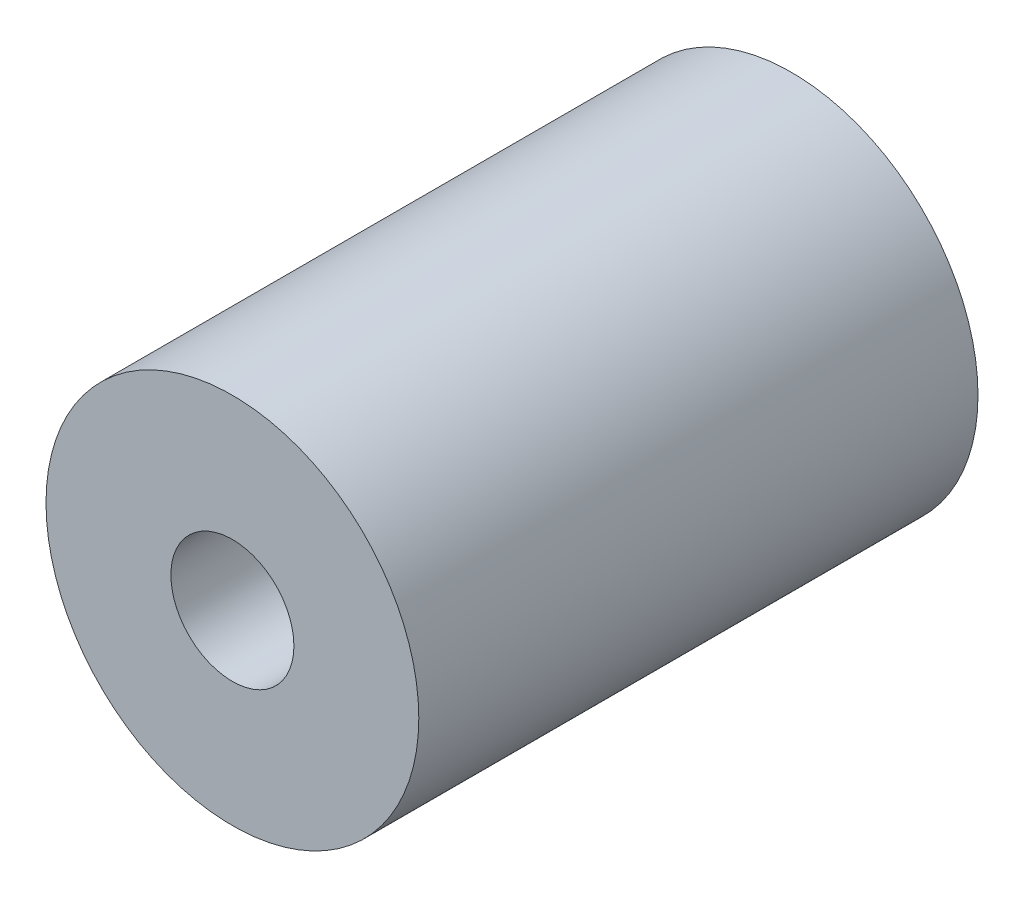
ISO-10303-21;
HEADER;
FILE_DESCRIPTION(('STEP AP214'),'2;1');
FILE_NAME('part.step','',(''),(''),'','','');
FILE_SCHEMA(('AUTOMOTIVE_DESIGN { 1 0 10303 214 1 1 1 1 }'));
ENDSEC;
DATA;
#1=APPLICATION_CONTEXT('core data for automotive mechanical design processes');
#2=APPLICATION_PROTOCOL_DEFINITION('international standard','automotive_design',2000,#1);
#3=PRODUCT_CONTEXT('',#1,'mechanical');
#4=PRODUCT('Part','Part','',(#3));
#5=PRODUCT_RELATED_PRODUCT_CATEGORY('part','',(#4));
#6=PRODUCT_DEFINITION_FORMATION('','',#4);
#7=PRODUCT_DEFINITION_CONTEXT('part definition',#1,'design');
#8=PRODUCT_DEFINITION('design','',#6,#7);
#9=PRODUCT_DEFINITION_SHAPE('','',#8);
#10=(LENGTH_UNIT() NAMED_UNIT(*) SI_UNIT(.MILLI.,.METRE.));
#11=(NAMED_UNIT(*) PLANE_ANGLE_UNIT() SI_UNIT($,.RADIAN.));
#12=(NAMED_UNIT(*) SI_UNIT($,.STERADIAN.) SOLID_ANGLE_UNIT());
#13=UNCERTAINTY_MEASURE_WITH_UNIT(LENGTH_MEASURE(1.E-05),#10,'distance_accuracy_value','');
#14=(GEOMETRIC_REPRESENTATION_CONTEXT(3) GLOBAL_UNCERTAINTY_ASSIGNED_CONTEXT((#13)) GLOBAL_UNIT_ASSIGNED_CONTEXT((#10,
#11,#12)) REPRESENTATION_CONTEXT('',''));
#15=CARTESIAN_POINT('',(0.,0.,0.));
#16=DIRECTION('',(0.,0.,1.));
#17=DIRECTION('',(1.,0.,0.));
#18=AXIS2_PLACEMENT_3D('',#15,#16,#17);
#19=CARTESIAN_POINT('',(0.,0.,15.));
#20=DIRECTION('',(0.,0.,1.));
#21=DIRECTION('',(1.,0.,0.));
#22=AXIS2_PLACEMENT_3D('',#19,#20,#21);
#23=PLANE('',#22);
#24=CARTESIAN_POINT('',(0.,0.,15.));
#25=DIRECTION('',(0.,0.,1.));
#26=DIRECTION('',(1.,0.,0.));
#27=AXIS2_PLACEMENT_3D('',#24,#25,#26);
#28=CIRCLE('',#27,5.);
#29=CARTESIAN_POINT('',(5.,0.,15.));
#30=VERTEX_POINT('',#29);
#31=EDGE_CURVE('E10',#30,#30,#28,.T.);
#32=ORIENTED_EDGE('',*,*,#31,.T.);
#33=EDGE_LOOP('',(#32));
#34=FACE_BOUND('',#33,.T.);
#35=CARTESIAN_POINT('',(0.,0.,15.));
#36=DIRECTION('',(0.,0.,1.));
#37=DIRECTION('',(1.,0.,0.));
#38=AXIS2_PLACEMENT_3D('',#35,#36,#37);
#39=CIRCLE('',#38,1.65);
#40=CARTESIAN_POINT('',(1.65,0.,15.));
#41=VERTEX_POINT('',#40);
#42=EDGE_CURVE('E42',#41,#41,#39,.T.);
#43=ORIENTED_EDGE('',*,*,#42,.F.);
#44=EDGE_LOOP('',(#43));
#45=FACE_BOUND('',#44,.T.);
#46=ADVANCED_FACE('F31',(#34,#45),#23,.T.);
#47=CARTESIAN_POINT('',(0.,0.,0.));
#48=DIRECTION('',(0.,0.,1.));
#49=DIRECTION('',(1.,0.,0.));
#50=AXIS2_PLACEMENT_3D('',#47,#48,#49);
#51=PLANE('',#50);
#52=CARTESIAN_POINT('',(0.,0.,0.));
#53=DIRECTION('',(0.,0.,1.));
#54=DIRECTION('',(1.,0.,0.));
#55=AXIS2_PLACEMENT_3D('',#52,#53,#54);
#56=CIRCLE('',#55,5.);
#57=CARTESIAN_POINT('',(5.,0.,0.));
#58=VERTEX_POINT('',#57);
#59=EDGE_CURVE('E35',#58,#58,#56,.T.);
#60=ORIENTED_EDGE('',*,*,#59,.F.);
#61=EDGE_LOOP('',(#60));
#62=FACE_BOUND('',#61,.T.);
#63=CARTESIAN_POINT('',(0.,0.,0.));
#64=DIRECTION('',(0.,0.,1.));
#65=DIRECTION('',(1.,0.,0.));
#66=AXIS2_PLACEMENT_3D('',#63,#64,#65);
#67=CIRCLE('',#66,1.65);
#68=CARTESIAN_POINT('',(1.65,0.,0.));
#69=VERTEX_POINT('',#68);
#70=EDGE_CURVE('E44',#69,#69,#67,.T.);
#71=ORIENTED_EDGE('',*,*,#70,.T.);
#72=EDGE_LOOP('',(#71));
#73=FACE_BOUND('',#72,.T.);
#74=ADVANCED_FACE('F54',(#62,#73),#51,.F.);
#75=CARTESIAN_POINT('',(0.,0.,15.));
#76=DIRECTION('',(0.,0.,-1.));
#77=DIRECTION('',(-1.,0.,0.));
#78=AXIS2_PLACEMENT_3D('',#75,#76,#77);
#79=CYLINDRICAL_SURFACE('',#78,5.);
#80=ORIENTED_EDGE('',*,*,#31,.F.);
#81=EDGE_LOOP('',(#80));
#82=FACE_BOUND('',#81,.T.);
#83=ORIENTED_EDGE('',*,*,#59,.T.);
#84=EDGE_LOOP('',(#83));
#85=FACE_BOUND('',#84,.T.);
#86=ADVANCED_FACE('F33',(#82,#85),#79,.T.);
#87=CARTESIAN_POINT('',(0.,0.,15.));
#88=DIRECTION('',(0.,0.,-1.));
#89=DIRECTION('',(-1.,0.,0.));
#90=AXIS2_PLACEMENT_3D('',#87,#88,#89);
#91=CYLINDRICAL_SURFACE('',#90,1.65);
#92=ORIENTED_EDGE('',*,*,#42,.T.);
#93=EDGE_LOOP('',(#92));
#94=FACE_BOUND('',#93,.T.);
#95=ORIENTED_EDGE('',*,*,#70,.F.);
#96=EDGE_LOOP('',(#95));
#97=FACE_BOUND('',#96,.T.);
#98=ADVANCED_FACE('F50',(#94,#97),#91,.F.);
#99=CLOSED_SHELL('',(#46,#74,#86,#98));
#100=MANIFOLD_SOLID_BREP('B2',#99);
#101=ADVANCED_BREP_SHAPE_REPRESENTATION('',(#18,#100),#14);
#102=SHAPE_DEFINITION_REPRESENTATION(#9,#101);
ENDSEC;
END-ISO-10303-21;
